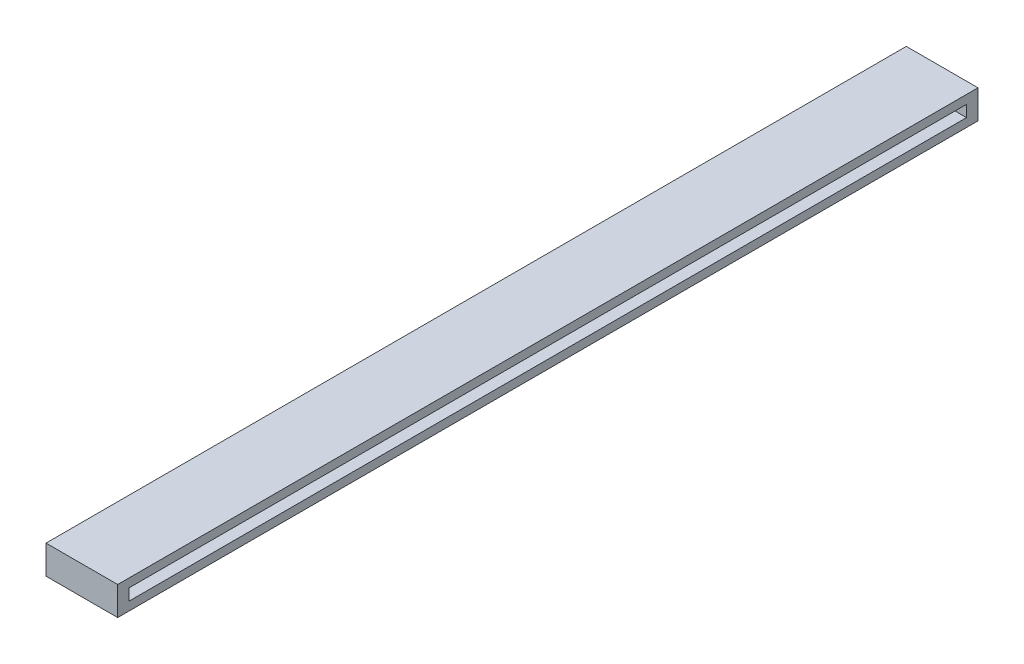
ISO-10303-21;
HEADER;
FILE_DESCRIPTION(('STEP AP214'),'2;1');
FILE_NAME('part.step','',(''),(''),'','','');
FILE_SCHEMA(('AUTOMOTIVE_DESIGN { 1 0 10303 214 1 1 1 1 }'));
ENDSEC;
DATA;
#1=APPLICATION_CONTEXT('core data for automotive mechanical design processes');
#2=APPLICATION_PROTOCOL_DEFINITION('international standard','automotive_design',2000,#1);
#3=PRODUCT_CONTEXT('',#1,'mechanical');
#4=PRODUCT('Part','Part','',(#3));
#5=PRODUCT_RELATED_PRODUCT_CATEGORY('part','',(#4));
#6=PRODUCT_DEFINITION_FORMATION('','',#4);
#7=PRODUCT_DEFINITION_CONTEXT('part definition',#1,'design');
#8=PRODUCT_DEFINITION('design','',#6,#7);
#9=PRODUCT_DEFINITION_SHAPE('','',#8);
#10=(LENGTH_UNIT() NAMED_UNIT(*) SI_UNIT(.MILLI.,.METRE.));
#11=(NAMED_UNIT(*) PLANE_ANGLE_UNIT() SI_UNIT($,.RADIAN.));
#12=(NAMED_UNIT(*) SI_UNIT($,.STERADIAN.) SOLID_ANGLE_UNIT());
#13=UNCERTAINTY_MEASURE_WITH_UNIT(LENGTH_MEASURE(1.E-05),#10,'distance_accuracy_value','');
#14=(GEOMETRIC_REPRESENTATION_CONTEXT(3) GLOBAL_UNCERTAINTY_ASSIGNED_CONTEXT((#13)) GLOBAL_UNIT_ASSIGNED_CONTEXT((#10,
#11,#12)) REPRESENTATION_CONTEXT('',''));
#15=CARTESIAN_POINT('',(0.,0.,0.));
#16=DIRECTION('',(0.,0.,1.));
#17=DIRECTION('',(1.,0.,0.));
#18=AXIS2_PLACEMENT_3D('',#15,#16,#17);
#19=CARTESIAN_POINT('',(-47.3362158107153,4.,-84.2911094295835));
#20=DIRECTION('',(-1.,0.,0.));
#21=DIRECTION('',(0.,0.,1.));
#22=AXIS2_PLACEMENT_3D('',#19,#20,#21);
#23=PLANE('',#22);
#24=DIRECTION('',(0.,1.,0.));
#25=VECTOR('',#24,1.);
#26=CARTESIAN_POINT('',(-47.3362158107153,4.,211.708890570417));
#27=LINE('',#26,#25);
#28=CARTESIAN_POINT('',(-47.3362158107153,0.,211.708890570417));
#29=VERTEX_POINT('',#28);
#30=CARTESIAN_POINT('',(-47.3362158107153,4.,211.708890570417));
#31=VERTEX_POINT('',#30);
#32=EDGE_CURVE('E149',#29,#31,#27,.T.);
#33=ORIENTED_EDGE('',*,*,#32,.F.);
#34=DIRECTION('',(0.,0.,-1.));
#35=VECTOR('',#34,1.);
#36=CARTESIAN_POINT('',(-47.3362158107153,0.,-84.2911094295835));
#37=LINE('',#36,#35);
#38=CARTESIAN_POINT('',(-47.3362158107153,0.,-80.2911094295835));
#39=VERTEX_POINT('',#38);
#40=EDGE_CURVE('E64',#29,#39,#37,.T.);
#41=ORIENTED_EDGE('',*,*,#40,.T.);
#42=DIRECTION('',(0.,-1.,0.));
#43=VECTOR('',#42,1.);
#44=CARTESIAN_POINT('',(-47.3362158107153,4.,-80.2911094295835));
#45=LINE('',#44,#43);
#46=CARTESIAN_POINT('',(-47.3362158107153,4.,-80.2911094295835));
#47=VERTEX_POINT('',#46);
#48=EDGE_CURVE('E155',#47,#39,#45,.T.);
#49=ORIENTED_EDGE('',*,*,#48,.F.);
#50=DIRECTION('',(0.,0.,-1.));
#51=VECTOR('',#50,1.);
#52=CARTESIAN_POINT('',(-47.3362158107153,4.,-84.2911094295835));
#53=LINE('',#52,#51);
#54=EDGE_CURVE('E56',#31,#47,#53,.T.);
#55=ORIENTED_EDGE('',*,*,#54,.F.);
#56=EDGE_LOOP('',(#33,#41,#49,#55));
#57=FACE_BOUND('',#56,.T.);
#58=ADVANCED_FACE('F41',(#57),#23,.F.);
#59=CARTESIAN_POINT('',(-62.3362158107153,4.,-84.2911094295835));
#60=DIRECTION('',(1.,0.,0.));
#61=DIRECTION('',(0.,0.,-1.));
#62=AXIS2_PLACEMENT_3D('',#59,#60,#61);
#63=PLANE('',#62);
#64=DIRECTION('',(0.,-1.,0.));
#65=VECTOR('',#64,1.);
#66=CARTESIAN_POINT('',(-62.3362158107153,4.,-84.2911094295835));
#67=LINE('',#66,#65);
#68=CARTESIAN_POINT('',(-62.3362158107153,7.,-84.2911094295835));
#69=VERTEX_POINT('',#68);
#70=CARTESIAN_POINT('',(-62.3362158107153,-3.,-84.2911094295835));
#71=VERTEX_POINT('',#70);
#72=EDGE_CURVE('E49',#69,#71,#67,.T.);
#73=ORIENTED_EDGE('',*,*,#72,.T.);
#74=DIRECTION('',(0.,0.,-1.));
#75=VECTOR('',#74,1.);
#76=CARTESIAN_POINT('',(-62.3362158107153,-3.,215.708890570417));
#77=LINE('',#76,#75);
#78=CARTESIAN_POINT('',(-62.3362158107153,-3.,215.708890570417));
#79=VERTEX_POINT('',#78);
#80=EDGE_CURVE('E107',#79,#71,#77,.T.);
#81=ORIENTED_EDGE('',*,*,#80,.F.);
#82=DIRECTION('',(0.,-1.,0.));
#83=VECTOR('',#82,1.);
#84=CARTESIAN_POINT('',(-62.3362158107153,4.,215.708890570417));
#85=LINE('',#84,#83);
#86=CARTESIAN_POINT('',(-62.3362158107153,7.,215.708890570417));
#87=VERTEX_POINT('',#86);
#88=EDGE_CURVE('E11',#87,#79,#85,.T.);
#89=ORIENTED_EDGE('',*,*,#88,.F.);
#90=DIRECTION('',(0.,0.,1.));
#91=VECTOR('',#90,1.);
#92=CARTESIAN_POINT('',(-62.3362158107153,7.,-84.2911094295835));
#93=LINE('',#92,#91);
#94=EDGE_CURVE('E109',#69,#87,#93,.T.);
#95=ORIENTED_EDGE('',*,*,#94,.F.);
#96=EDGE_LOOP('',(#73,#81,#89,#95));
#97=FACE_BOUND('',#96,.T.);
#98=ADVANCED_FACE('F43',(#97),#63,.F.);
#99=CARTESIAN_POINT('',(-62.3362158107153,4.,215.708890570417));
#100=DIRECTION('',(0.,0.,-1.));
#101=DIRECTION('',(-1.,0.,0.));
#102=AXIS2_PLACEMENT_3D('',#99,#100,#101);
#103=PLANE('',#102);
#104=ORIENTED_EDGE('',*,*,#88,.T.);
#105=DIRECTION('',(-1.,0.,0.));
#106=VECTOR('',#105,1.);
#107=CARTESIAN_POINT('',(-62.3362158107153,-3.,215.708890570417));
#108=LINE('',#107,#106);
#109=CARTESIAN_POINT('',(-37.3362158107153,-3.,215.708890570417));
#110=VERTEX_POINT('',#109);
#111=EDGE_CURVE('E125',#110,#79,#108,.T.);
#112=ORIENTED_EDGE('',*,*,#111,.F.);
#113=DIRECTION('',(0.,-1.,0.));
#114=VECTOR('',#113,1.);
#115=CARTESIAN_POINT('',(-37.3362158107153,4.,215.708890570417));
#116=LINE('',#115,#114);
#117=CARTESIAN_POINT('',(-37.3362158107153,7.,215.708890570417));
#118=VERTEX_POINT('',#117);
#119=EDGE_CURVE('E146',#118,#110,#116,.T.);
#120=ORIENTED_EDGE('',*,*,#119,.F.);
#121=DIRECTION('',(1.,0.,0.));
#122=VECTOR('',#121,1.);
#123=CARTESIAN_POINT('',(-62.3362158107153,7.,215.708890570417));
#124=LINE('',#123,#122);
#125=EDGE_CURVE('E135',#87,#118,#124,.T.);
#126=ORIENTED_EDGE('',*,*,#125,.F.);
#127=EDGE_LOOP('',(#104,#112,#120,#126));
#128=FACE_BOUND('',#127,.T.);
#129=ADVANCED_FACE('F200',(#128),#103,.F.);
#130=CARTESIAN_POINT('',(-62.3362158107153,4.,-84.2911094295835));
#131=DIRECTION('',(0.,0.,1.));
#132=DIRECTION('',(1.,0.,0.));
#133=AXIS2_PLACEMENT_3D('',#130,#131,#132);
#134=PLANE('',#133);
#135=DIRECTION('',(0.,1.,0.));
#136=VECTOR('',#135,1.);
#137=CARTESIAN_POINT('',(-37.3362158107153,4.,-84.2911094295835));
#138=LINE('',#137,#136);
#139=CARTESIAN_POINT('',(-37.3362158107153,-3.,-84.2911094295835));
#140=VERTEX_POINT('',#139);
#141=CARTESIAN_POINT('',(-37.3362158107153,7.,-84.2911094295835));
#142=VERTEX_POINT('',#141);
#143=EDGE_CURVE('E116',#140,#142,#138,.T.);
#144=ORIENTED_EDGE('',*,*,#143,.F.);
#145=DIRECTION('',(1.,0.,0.));
#146=VECTOR('',#145,1.);
#147=CARTESIAN_POINT('',(-62.3362158107153,-3.,-84.2911094295835));
#148=LINE('',#147,#146);
#149=EDGE_CURVE('E114',#71,#140,#148,.T.);
#150=ORIENTED_EDGE('',*,*,#149,.F.);
#151=ORIENTED_EDGE('',*,*,#72,.F.);
#152=DIRECTION('',(-1.,0.,0.));
#153=VECTOR('',#152,1.);
#154=CARTESIAN_POINT('',(-62.3362158107153,7.,-84.2911094295835));
#155=LINE('',#154,#153);
#156=EDGE_CURVE('E141',#142,#69,#155,.T.);
#157=ORIENTED_EDGE('',*,*,#156,.F.);
#158=EDGE_LOOP('',(#144,#150,#151,#157));
#159=FACE_BOUND('',#158,.T.);
#160=ADVANCED_FACE('F115',(#159),#134,.F.);
#161=CARTESIAN_POINT('',(-37.3362158107153,4.,-80.2911094295835));
#162=DIRECTION('',(0.,0.,-1.));
#163=DIRECTION('',(-1.,0.,0.));
#164=AXIS2_PLACEMENT_3D('',#161,#162,#163);
#165=PLANE('',#164);
#166=ORIENTED_EDGE('',*,*,#48,.T.);
#167=DIRECTION('',(-1.,0.,0.));
#168=VECTOR('',#167,1.);
#169=CARTESIAN_POINT('',(-37.3362158107153,0.,-80.2911094295835));
#170=LINE('',#169,#168);
#171=CARTESIAN_POINT('',(-37.3362158107153,0.,-80.2911094295835));
#172=VERTEX_POINT('',#171);
#173=EDGE_CURVE('E162',#172,#39,#170,.T.);
#174=ORIENTED_EDGE('',*,*,#173,.F.);
#175=DIRECTION('',(0.,-1.,0.));
#176=VECTOR('',#175,1.);
#177=CARTESIAN_POINT('',(-37.3362158107153,4.,-80.2911094295835));
#178=LINE('',#177,#176);
#179=CARTESIAN_POINT('',(-37.3362158107153,4.,-80.2911094295835));
#180=VERTEX_POINT('',#179);
#181=EDGE_CURVE('E164',#180,#172,#178,.T.);
#182=ORIENTED_EDGE('',*,*,#181,.F.);
#183=DIRECTION('',(-1.,0.,0.));
#184=VECTOR('',#183,1.);
#185=CARTESIAN_POINT('',(-37.3362158107153,4.,-80.2911094295835));
#186=LINE('',#185,#184);
#187=EDGE_CURVE('E143',#180,#47,#186,.T.);
#188=ORIENTED_EDGE('',*,*,#187,.T.);
#189=EDGE_LOOP('',(#166,#174,#182,#188));
#190=FACE_BOUND('',#189,.T.);
#191=ADVANCED_FACE('F174',(#190),#165,.F.);
#192=CARTESIAN_POINT('',(-37.3362158107153,4.,211.708890570417));
#193=DIRECTION('',(0.,0.,1.));
#194=DIRECTION('',(1.,0.,0.));
#195=AXIS2_PLACEMENT_3D('',#192,#193,#194);
#196=PLANE('',#195);
#197=ORIENTED_EDGE('',*,*,#32,.T.);
#198=DIRECTION('',(-1.,0.,0.));
#199=VECTOR('',#198,1.);
#200=CARTESIAN_POINT('',(-37.3362158107153,4.,211.708890570417));
#201=LINE('',#200,#199);
#202=CARTESIAN_POINT('',(-37.3362158107153,4.,211.708890570417));
#203=VERTEX_POINT('',#202);
#204=EDGE_CURVE('E152',#203,#31,#201,.T.);
#205=ORIENTED_EDGE('',*,*,#204,.F.);
#206=DIRECTION('',(0.,1.,0.));
#207=VECTOR('',#206,1.);
#208=CARTESIAN_POINT('',(-37.3362158107153,4.,211.708890570417));
#209=LINE('',#208,#207);
#210=CARTESIAN_POINT('',(-37.3362158107153,0.,211.708890570417));
#211=VERTEX_POINT('',#210);
#212=EDGE_CURVE('E148',#211,#203,#209,.T.);
#213=ORIENTED_EDGE('',*,*,#212,.F.);
#214=DIRECTION('',(-1.,0.,0.));
#215=VECTOR('',#214,1.);
#216=CARTESIAN_POINT('',(-37.3362158107153,0.,211.708890570417));
#217=LINE('',#216,#215);
#218=EDGE_CURVE('E157',#211,#29,#217,.T.);
#219=ORIENTED_EDGE('',*,*,#218,.T.);
#220=EDGE_LOOP('',(#197,#205,#213,#219));
#221=FACE_BOUND('',#220,.T.);
#222=ADVANCED_FACE('F182',(#221),#196,.F.);
#223=CARTESIAN_POINT('',(-37.3362158107153,0.,0.));
#224=DIRECTION('',(1.,0.,0.));
#225=DIRECTION('',(0.,0.,-1.));
#226=AXIS2_PLACEMENT_3D('',#223,#224,#225);
#227=PLANE('',#226);
#228=DIRECTION('',(0.,0.,1.));
#229=VECTOR('',#228,1.);
#230=CARTESIAN_POINT('',(-37.3362158107153,-3.,215.708890570417));
#231=LINE('',#230,#229);
#232=EDGE_CURVE('E120',#140,#110,#231,.T.);
#233=ORIENTED_EDGE('',*,*,#232,.F.);
#234=ORIENTED_EDGE('',*,*,#143,.T.);
#235=DIRECTION('',(0.,0.,-1.));
#236=VECTOR('',#235,1.);
#237=CARTESIAN_POINT('',(-37.3362158107153,7.,-84.2911094295835));
#238=LINE('',#237,#236);
#239=EDGE_CURVE('E138',#118,#142,#238,.T.);
#240=ORIENTED_EDGE('',*,*,#239,.F.);
#241=ORIENTED_EDGE('',*,*,#119,.T.);
#242=EDGE_LOOP('',(#233,#234,#240,#241));
#243=FACE_BOUND('',#242,.T.);
#244=ORIENTED_EDGE('',*,*,#181,.T.);
#245=DIRECTION('',(0.,0.,1.));
#246=VECTOR('',#245,1.);
#247=CARTESIAN_POINT('',(-37.3362158107153,0.,215.708890570417));
#248=LINE('',#247,#246);
#249=EDGE_CURVE('E126',#172,#211,#248,.T.);
#250=ORIENTED_EDGE('',*,*,#249,.T.);
#251=ORIENTED_EDGE('',*,*,#212,.T.);
#252=DIRECTION('',(0.,0.,-1.));
#253=VECTOR('',#252,1.);
#254=CARTESIAN_POINT('',(-37.3362158107153,4.,-84.2911094295835));
#255=LINE('',#254,#253);
#256=EDGE_CURVE('E132',#203,#180,#255,.T.);
#257=ORIENTED_EDGE('',*,*,#256,.T.);
#258=EDGE_LOOP('',(#244,#250,#251,#257));
#259=FACE_BOUND('',#258,.T.);
#260=ADVANCED_FACE('F178',(#243,#259),#227,.T.);
#261=CARTESIAN_POINT('',(0.,4.,0.));
#262=DIRECTION('',(0.,1.,0.));
#263=DIRECTION('',(0.,0.,1.));
#264=AXIS2_PLACEMENT_3D('',#261,#262,#263);
#265=PLANE('',#264);
#266=ORIENTED_EDGE('',*,*,#256,.F.);
#267=ORIENTED_EDGE('',*,*,#204,.T.);
#268=ORIENTED_EDGE('',*,*,#54,.T.);
#269=ORIENTED_EDGE('',*,*,#187,.F.);
#270=EDGE_LOOP('',(#266,#267,#268,#269));
#271=FACE_BOUND('',#270,.T.);
#272=ADVANCED_FACE('F176',(#271),#265,.F.);
#273=CARTESIAN_POINT('',(0.,7.,0.));
#274=DIRECTION('',(0.,1.,0.));
#275=DIRECTION('',(0.,0.,1.));
#276=AXIS2_PLACEMENT_3D('',#273,#274,#275);
#277=PLANE('',#276);
#278=ORIENTED_EDGE('',*,*,#94,.T.);
#279=ORIENTED_EDGE('',*,*,#125,.T.);
#280=ORIENTED_EDGE('',*,*,#239,.T.);
#281=ORIENTED_EDGE('',*,*,#156,.T.);
#282=EDGE_LOOP('',(#278,#279,#280,#281));
#283=FACE_BOUND('',#282,.T.);
#284=ADVANCED_FACE('F185',(#283),#277,.T.);
#285=CARTESIAN_POINT('',(0.,0.,0.));
#286=DIRECTION('',(0.,-1.,0.));
#287=DIRECTION('',(0.,0.,-1.));
#288=AXIS2_PLACEMENT_3D('',#285,#286,#287);
#289=PLANE('',#288);
#290=ORIENTED_EDGE('',*,*,#249,.F.);
#291=ORIENTED_EDGE('',*,*,#173,.T.);
#292=ORIENTED_EDGE('',*,*,#40,.F.);
#293=ORIENTED_EDGE('',*,*,#218,.F.);
#294=EDGE_LOOP('',(#290,#291,#292,#293));
#295=FACE_BOUND('',#294,.T.);
#296=ADVANCED_FACE('F183',(#295),#289,.F.);
#297=CARTESIAN_POINT('',(0.,-3.,0.));
#298=DIRECTION('',(0.,-1.,0.));
#299=DIRECTION('',(0.,0.,-1.));
#300=AXIS2_PLACEMENT_3D('',#297,#298,#299);
#301=PLANE('',#300);
#302=ORIENTED_EDGE('',*,*,#80,.T.);
#303=ORIENTED_EDGE('',*,*,#149,.T.);
#304=ORIENTED_EDGE('',*,*,#232,.T.);
#305=ORIENTED_EDGE('',*,*,#111,.T.);
#306=EDGE_LOOP('',(#302,#303,#304,#305));
#307=FACE_BOUND('',#306,.T.);
#308=ADVANCED_FACE('F123',(#307),#301,.T.);
#309=CLOSED_SHELL('',(#58,#98,#129,#160,#191,#222,#260,#272,#284,#296,#308));
#310=MANIFOLD_SOLID_BREP('B2',#309);
#311=ADVANCED_BREP_SHAPE_REPRESENTATION('',(#18,#310),#14);
#312=SHAPE_DEFINITION_REPRESENTATION(#9,#311);
ENDSEC;
END-ISO-10303-21;
